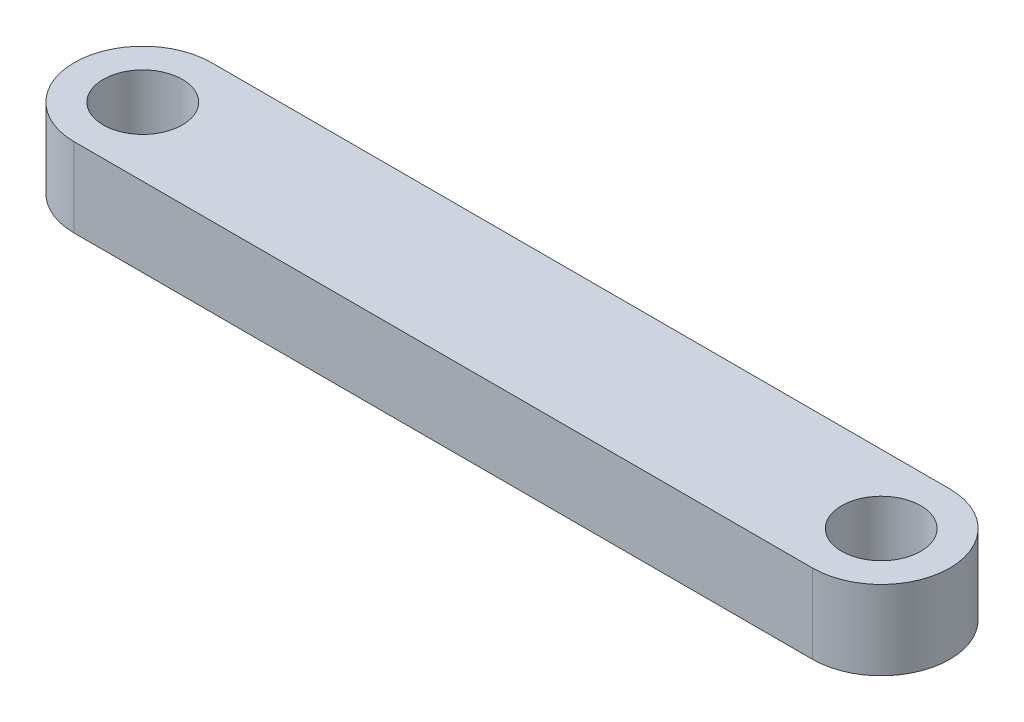
ISO-10303-21;
HEADER;
FILE_DESCRIPTION(('STEP AP214'),'2;1');
FILE_NAME('part.step','',(''),(''),'','','');
FILE_SCHEMA(('AUTOMOTIVE_DESIGN { 1 0 10303 214 1 1 1 1 }'));
ENDSEC;
DATA;
#1=APPLICATION_CONTEXT('core data for automotive mechanical design processes');
#2=APPLICATION_PROTOCOL_DEFINITION('international standard','automotive_design',2000,#1);
#3=PRODUCT_CONTEXT('',#1,'mechanical');
#4=PRODUCT('Part','Part','',(#3));
#5=PRODUCT_RELATED_PRODUCT_CATEGORY('part','',(#4));
#6=PRODUCT_DEFINITION_FORMATION('','',#4);
#7=PRODUCT_DEFINITION_CONTEXT('part definition',#1,'design');
#8=PRODUCT_DEFINITION('design','',#6,#7);
#9=PRODUCT_DEFINITION_SHAPE('','',#8);
#10=(LENGTH_UNIT() NAMED_UNIT(*) SI_UNIT(.MILLI.,.METRE.));
#11=(NAMED_UNIT(*) PLANE_ANGLE_UNIT() SI_UNIT($,.RADIAN.));
#12=(NAMED_UNIT(*) SI_UNIT($,.STERADIAN.) SOLID_ANGLE_UNIT());
#13=UNCERTAINTY_MEASURE_WITH_UNIT(LENGTH_MEASURE(1.E-05),#10,'distance_accuracy_value','');
#14=(GEOMETRIC_REPRESENTATION_CONTEXT(3) GLOBAL_UNCERTAINTY_ASSIGNED_CONTEXT((#13)) GLOBAL_UNIT_ASSIGNED_CONTEXT((#10,
#11,#12)) REPRESENTATION_CONTEXT('',''));
#15=CARTESIAN_POINT('',(0.,0.,0.));
#16=DIRECTION('',(0.,0.,1.));
#17=DIRECTION('',(1.,0.,0.));
#18=AXIS2_PLACEMENT_3D('',#15,#16,#17);
#19=CARTESIAN_POINT('',(70.,15.,0.));
#20=DIRECTION('',(0.,-1.,0.));
#21=DIRECTION('',(0.,0.,-1.));
#22=AXIS2_PLACEMENT_3D('',#19,#20,#21);
#23=CYLINDRICAL_SURFACE('',#22,13.);
#24=CARTESIAN_POINT('',(70.,0.,0.));
#25=DIRECTION('',(0.,1.,0.));
#26=DIRECTION('',(0.,0.,1.));
#27=AXIS2_PLACEMENT_3D('',#24,#25,#26);
#28=CIRCLE('',#27,13.);
#29=CARTESIAN_POINT('',(70.,0.,-13.));
#30=VERTEX_POINT('',#29);
#31=CARTESIAN_POINT('',(70.,0.,13.));
#32=VERTEX_POINT('',#31);
#33=EDGE_CURVE('E110',#30,#32,#28,.F.);
#34=ORIENTED_EDGE('',*,*,#33,.F.);
#35=DIRECTION('',(0.,-1.,0.));
#36=VECTOR('',#35,1.);
#37=CARTESIAN_POINT('',(70.,15.,-13.));
#38=LINE('',#37,#36);
#39=CARTESIAN_POINT('',(70.,15.,-13.));
#40=VERTEX_POINT('',#39);
#41=EDGE_CURVE('E11',#40,#30,#38,.T.);
#42=ORIENTED_EDGE('',*,*,#41,.F.);
#43=CARTESIAN_POINT('',(70.,15.,0.));
#44=DIRECTION('',(0.,1.,0.));
#45=DIRECTION('',(0.,0.,1.));
#46=AXIS2_PLACEMENT_3D('',#43,#44,#45);
#47=CIRCLE('',#46,13.);
#48=CARTESIAN_POINT('',(70.,15.,13.));
#49=VERTEX_POINT('',#48);
#50=EDGE_CURVE('E97',#40,#49,#47,.F.);
#51=ORIENTED_EDGE('',*,*,#50,.T.);
#52=DIRECTION('',(0.,-1.,0.));
#53=VECTOR('',#52,1.);
#54=CARTESIAN_POINT('',(70.,15.,13.));
#55=LINE('',#54,#53);
#56=EDGE_CURVE('E79',#49,#32,#55,.T.);
#57=ORIENTED_EDGE('',*,*,#56,.T.);
#58=EDGE_LOOP('',(#34,#42,#51,#57));
#59=FACE_BOUND('',#58,.T.);
#60=ADVANCED_FACE('F40',(#59),#23,.T.);
#61=CARTESIAN_POINT('',(0.,15.,-13.));
#62=DIRECTION('',(0.,0.,-1.));
#63=DIRECTION('',(-1.,0.,0.));
#64=AXIS2_PLACEMENT_3D('',#61,#62,#63);
#65=PLANE('',#64);
#66=DIRECTION('',(1.,0.,0.));
#67=VECTOR('',#66,1.);
#68=CARTESIAN_POINT('',(0.,0.,-13.));
#69=LINE('',#68,#67);
#70=CARTESIAN_POINT('',(-70.,0.,-13.));
#71=VERTEX_POINT('',#70);
#72=EDGE_CURVE('E90',#71,#30,#69,.T.);
#73=ORIENTED_EDGE('',*,*,#72,.F.);
#74=DIRECTION('',(0.,-1.,0.));
#75=VECTOR('',#74,1.);
#76=CARTESIAN_POINT('',(-70.,15.,-13.));
#77=LINE('',#76,#75);
#78=CARTESIAN_POINT('',(-70.,15.,-13.));
#79=VERTEX_POINT('',#78);
#80=EDGE_CURVE('E49',#79,#71,#77,.T.);
#81=ORIENTED_EDGE('',*,*,#80,.F.);
#82=DIRECTION('',(1.,0.,0.));
#83=VECTOR('',#82,1.);
#84=CARTESIAN_POINT('',(0.,15.,-13.));
#85=LINE('',#84,#83);
#86=EDGE_CURVE('E88',#79,#40,#85,.T.);
#87=ORIENTED_EDGE('',*,*,#86,.T.);
#88=ORIENTED_EDGE('',*,*,#41,.T.);
#89=EDGE_LOOP('',(#73,#81,#87,#88));
#90=FACE_BOUND('',#89,.T.);
#91=ADVANCED_FACE('F87',(#90),#65,.T.);
#92=CARTESIAN_POINT('',(-70.,15.,0.));
#93=DIRECTION('',(0.,-1.,0.));
#94=DIRECTION('',(0.,0.,-1.));
#95=AXIS2_PLACEMENT_3D('',#92,#93,#94);
#96=CYLINDRICAL_SURFACE('',#95,13.);
#97=CARTESIAN_POINT('',(-70.,0.,0.));
#98=DIRECTION('',(0.,1.,0.));
#99=DIRECTION('',(0.,0.,1.));
#100=AXIS2_PLACEMENT_3D('',#97,#98,#99);
#101=CIRCLE('',#100,13.);
#102=CARTESIAN_POINT('',(-70.,0.,13.));
#103=VERTEX_POINT('',#102);
#104=EDGE_CURVE('E114',#103,#71,#101,.F.);
#105=ORIENTED_EDGE('',*,*,#104,.F.);
#106=DIRECTION('',(0.,-1.,0.));
#107=VECTOR('',#106,1.);
#108=CARTESIAN_POINT('',(-70.,15.,13.));
#109=LINE('',#108,#107);
#110=CARTESIAN_POINT('',(-70.,15.,13.));
#111=VERTEX_POINT('',#110);
#112=EDGE_CURVE('E72',#111,#103,#109,.T.);
#113=ORIENTED_EDGE('',*,*,#112,.F.);
#114=CARTESIAN_POINT('',(-70.,15.,0.));
#115=DIRECTION('',(0.,1.,0.));
#116=DIRECTION('',(0.,0.,1.));
#117=AXIS2_PLACEMENT_3D('',#114,#115,#116);
#118=CIRCLE('',#117,13.);
#119=EDGE_CURVE('E96',#111,#79,#118,.F.);
#120=ORIENTED_EDGE('',*,*,#119,.T.);
#121=ORIENTED_EDGE('',*,*,#80,.T.);
#122=EDGE_LOOP('',(#105,#113,#120,#121));
#123=FACE_BOUND('',#122,.T.);
#124=ADVANCED_FACE('F99',(#123),#96,.T.);
#125=CARTESIAN_POINT('',(-70.,15.,0.));
#126=DIRECTION('',(0.,-1.,0.));
#127=DIRECTION('',(0.,0.,-1.));
#128=AXIS2_PLACEMENT_3D('',#125,#126,#127);
#129=CYLINDRICAL_SURFACE('',#128,7.50000000000001);
#130=CARTESIAN_POINT('',(-70.,15.,0.));
#131=DIRECTION('',(0.,1.,0.));
#132=DIRECTION('',(0.,0.,1.));
#133=AXIS2_PLACEMENT_3D('',#130,#131,#132);
#134=CIRCLE('',#133,7.50000000000001);
#135=CARTESIAN_POINT('',(-70.,15.,7.50000000000001));
#136=VERTEX_POINT('',#135);
#137=EDGE_CURVE('E121',#136,#136,#134,.F.);
#138=ORIENTED_EDGE('',*,*,#137,.F.);
#139=EDGE_LOOP('',(#138));
#140=FACE_BOUND('',#139,.T.);
#141=CARTESIAN_POINT('',(-70.,0.,0.));
#142=DIRECTION('',(0.,1.,0.));
#143=DIRECTION('',(0.,0.,1.));
#144=AXIS2_PLACEMENT_3D('',#141,#142,#143);
#145=CIRCLE('',#144,7.50000000000001);
#146=CARTESIAN_POINT('',(-70.,0.,7.50000000000001));
#147=VERTEX_POINT('',#146);
#148=EDGE_CURVE('E107',#147,#147,#145,.F.);
#149=ORIENTED_EDGE('',*,*,#148,.T.);
#150=EDGE_LOOP('',(#149));
#151=FACE_BOUND('',#150,.T.);
#152=ADVANCED_FACE('F134',(#140,#151),#129,.F.);
#153=CARTESIAN_POINT('',(70.,15.,0.));
#154=DIRECTION('',(0.,-1.,0.));
#155=DIRECTION('',(0.,0.,-1.));
#156=AXIS2_PLACEMENT_3D('',#153,#154,#155);
#157=CYLINDRICAL_SURFACE('',#156,7.50000000000001);
#158=CARTESIAN_POINT('',(70.,15.,0.));
#159=DIRECTION('',(0.,1.,0.));
#160=DIRECTION('',(0.,0.,1.));
#161=AXIS2_PLACEMENT_3D('',#158,#159,#160);
#162=CIRCLE('',#161,7.50000000000001);
#163=CARTESIAN_POINT('',(70.,15.,7.50000000000004));
#164=VERTEX_POINT('',#163);
#165=EDGE_CURVE('E118',#164,#164,#162,.F.);
#166=ORIENTED_EDGE('',*,*,#165,.F.);
#167=EDGE_LOOP('',(#166));
#168=FACE_BOUND('',#167,.T.);
#169=CARTESIAN_POINT('',(70.,0.,0.));
#170=DIRECTION('',(0.,1.,0.));
#171=DIRECTION('',(0.,0.,1.));
#172=AXIS2_PLACEMENT_3D('',#169,#170,#171);
#173=CIRCLE('',#172,7.50000000000001);
#174=CARTESIAN_POINT('',(70.,0.,7.50000000000004));
#175=VERTEX_POINT('',#174);
#176=EDGE_CURVE('E104',#175,#175,#173,.F.);
#177=ORIENTED_EDGE('',*,*,#176,.T.);
#178=EDGE_LOOP('',(#177));
#179=FACE_BOUND('',#178,.T.);
#180=ADVANCED_FACE('F42',(#168,#179),#157,.F.);
#181=CARTESIAN_POINT('',(0.,15.,13.));
#182=DIRECTION('',(0.,0.,-1.));
#183=DIRECTION('',(-1.,0.,0.));
#184=AXIS2_PLACEMENT_3D('',#181,#182,#183);
#185=PLANE('',#184);
#186=DIRECTION('',(1.,0.,0.));
#187=VECTOR('',#186,1.);
#188=CARTESIAN_POINT('',(0.,0.,13.));
#189=LINE('',#188,#187);
#190=EDGE_CURVE('E116',#103,#32,#189,.T.);
#191=ORIENTED_EDGE('',*,*,#190,.T.);
#192=ORIENTED_EDGE('',*,*,#56,.F.);
#193=DIRECTION('',(1.,0.,0.));
#194=VECTOR('',#193,1.);
#195=CARTESIAN_POINT('',(0.,15.,13.));
#196=LINE('',#195,#194);
#197=EDGE_CURVE('E57',#111,#49,#196,.T.);
#198=ORIENTED_EDGE('',*,*,#197,.F.);
#199=ORIENTED_EDGE('',*,*,#112,.T.);
#200=EDGE_LOOP('',(#191,#192,#198,#199));
#201=FACE_BOUND('',#200,.T.);
#202=ADVANCED_FACE('F141',(#201),#185,.F.);
#203=CARTESIAN_POINT('',(0.,15.,0.));
#204=DIRECTION('',(0.,1.,0.));
#205=DIRECTION('',(0.,0.,1.));
#206=AXIS2_PLACEMENT_3D('',#203,#204,#205);
#207=PLANE('',#206);
#208=ORIENTED_EDGE('',*,*,#165,.T.);
#209=EDGE_LOOP('',(#208));
#210=FACE_BOUND('',#209,.T.);
#211=ORIENTED_EDGE('',*,*,#137,.T.);
#212=EDGE_LOOP('',(#211));
#213=FACE_BOUND('',#212,.T.);
#214=ORIENTED_EDGE('',*,*,#50,.F.);
#215=ORIENTED_EDGE('',*,*,#86,.F.);
#216=ORIENTED_EDGE('',*,*,#119,.F.);
#217=ORIENTED_EDGE('',*,*,#197,.T.);
#218=EDGE_LOOP('',(#214,#215,#216,#217));
#219=FACE_BOUND('',#218,.T.);
#220=ADVANCED_FACE('F95',(#210,#213,#219),#207,.T.);
#221=CARTESIAN_POINT('',(0.,0.,0.));
#222=DIRECTION('',(0.,1.,0.));
#223=DIRECTION('',(0.,0.,1.));
#224=AXIS2_PLACEMENT_3D('',#221,#222,#223);
#225=PLANE('',#224);
#226=ORIENTED_EDGE('',*,*,#176,.F.);
#227=EDGE_LOOP('',(#226));
#228=FACE_BOUND('',#227,.T.);
#229=ORIENTED_EDGE('',*,*,#148,.F.);
#230=EDGE_LOOP('',(#229));
#231=FACE_BOUND('',#230,.T.);
#232=ORIENTED_EDGE('',*,*,#33,.T.);
#233=ORIENTED_EDGE('',*,*,#190,.F.);
#234=ORIENTED_EDGE('',*,*,#104,.T.);
#235=ORIENTED_EDGE('',*,*,#72,.T.);
#236=EDGE_LOOP('',(#232,#233,#234,#235));
#237=FACE_BOUND('',#236,.T.);
#238=ADVANCED_FACE('F147',(#228,#231,#237),#225,.F.);
#239=CLOSED_SHELL('',(#60,#91,#124,#152,#180,#202,#220,#238));
#240=MANIFOLD_SOLID_BREP('B2',#239);
#241=ADVANCED_BREP_SHAPE_REPRESENTATION('',(#18,#240),#14);
#242=SHAPE_DEFINITION_REPRESENTATION(#9,#241);
ENDSEC;
END-ISO-10303-21;
